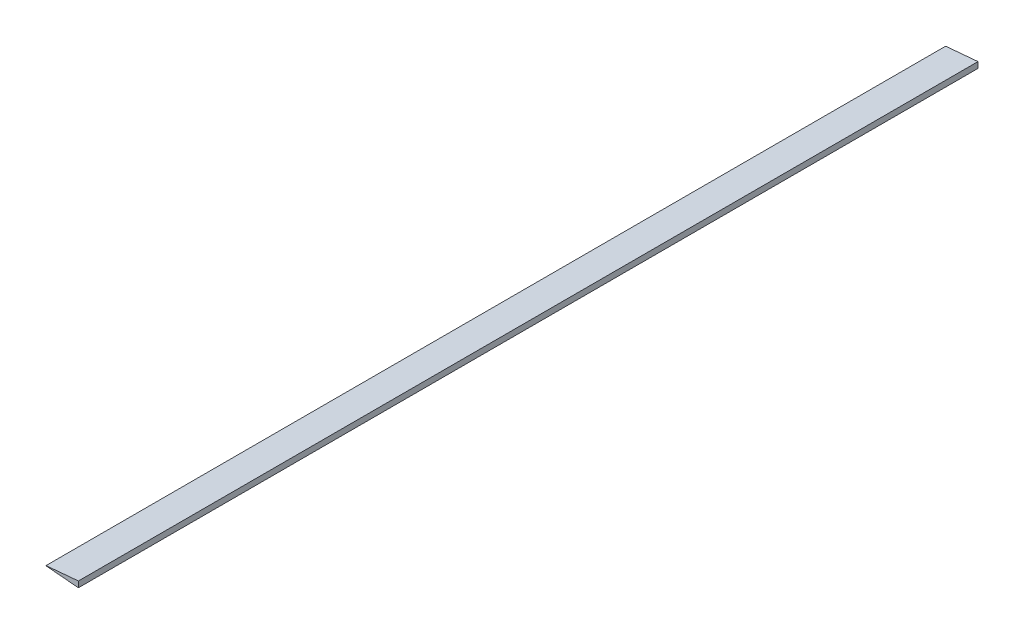
ISO-10303-21;
HEADER;
FILE_DESCRIPTION(('STEP AP214'),'2;1');
FILE_NAME('part.step','',(''),(''),'','','');
FILE_SCHEMA(('AUTOMOTIVE_DESIGN { 1 0 10303 214 1 1 1 1 }'));
ENDSEC;
DATA;
#1=APPLICATION_CONTEXT('core data for automotive mechanical design processes');
#2=APPLICATION_PROTOCOL_DEFINITION('international standard','automotive_design',2000,#1);
#3=PRODUCT_CONTEXT('',#1,'mechanical');
#4=PRODUCT('Part','Part','',(#3));
#5=PRODUCT_RELATED_PRODUCT_CATEGORY('part','',(#4));
#6=PRODUCT_DEFINITION_FORMATION('','',#4);
#7=PRODUCT_DEFINITION_CONTEXT('part definition',#1,'design');
#8=PRODUCT_DEFINITION('design','',#6,#7);
#9=PRODUCT_DEFINITION_SHAPE('','',#8);
#10=(LENGTH_UNIT() NAMED_UNIT(*) SI_UNIT(.MILLI.,.METRE.));
#11=(NAMED_UNIT(*) PLANE_ANGLE_UNIT() SI_UNIT($,.RADIAN.));
#12=(NAMED_UNIT(*) SI_UNIT($,.STERADIAN.) SOLID_ANGLE_UNIT());
#13=UNCERTAINTY_MEASURE_WITH_UNIT(LENGTH_MEASURE(1.E-05),#10,'distance_accuracy_value','');
#14=(GEOMETRIC_REPRESENTATION_CONTEXT(3) GLOBAL_UNCERTAINTY_ASSIGNED_CONTEXT((#13)) GLOBAL_UNIT_ASSIGNED_CONTEXT((#10,
#11,#12)) REPRESENTATION_CONTEXT('',''));
#15=CARTESIAN_POINT('',(0.,0.,0.));
#16=DIRECTION('',(0.,0.,1.));
#17=DIRECTION('',(1.,0.,0.));
#18=AXIS2_PLACEMENT_3D('',#15,#16,#17);
#19=CARTESIAN_POINT('',(-71.0668,2.78897868056826,422.9));
#20=CARTESIAN_POINT('',(-71.1807897571312,2.78093550481533,422.9));
#21=CARTESIAN_POINT('',(-72.8734497352901,2.66150054822879,422.9));
#22=CARTESIAN_POINT('',(-76.0510054904732,2.41542144462371,422.9));
#23=CARTESIAN_POINT('',(-80.4909559360826,2.06094965648102,422.9));
#24=CARTESIAN_POINT('',(-84.6050202734697,1.71289433734421,422.9));
#25=CARTESIAN_POINT('',(-88.3483327276746,1.38202871151509,422.9));
#26=CARTESIAN_POINT('',(-91.6798265467708,1.07524364668175,422.9));
#27=CARTESIAN_POINT('',(-94.5630134148428,0.80009068587035,422.9));
#28=CARTESIAN_POINT('',(-96.9663063511276,0.563544810077896,422.9));
#29=CARTESIAN_POINT('',(-98.8633848097534,0.372017597584994,422.9));
#30=CARTESIAN_POINT('',(-100.233471889195,0.230936429918391,422.9));
#31=CARTESIAN_POINT('',(-101.061573115194,0.144551224403757,422.9));
#32=CARTESIAN_POINT('',(-101.43130746455,0.105684165708269,422.9));
#33=CARTESIAN_POINT('',(-101.524,0.0959401799999983,422.9));
#34=B_SPLINE_CURVE_WITH_KNOTS('',3,(#19,#20,#21,#22,#23,#24,#25,#26,#27,#28,#29,#30,#31,#32,
#33),.UNSPECIFIED.,.F.,.F.,(4,1,1,1,1,1,1,1,1,1,1,1,4),(0.,0.0112115722778321,0.166483201337751,
0.312686160175411,0.448210552609216,0.571562715657405,0.681381362004341,0.776452466822885,
0.855722863352052,0.918312437422216,0.963524724344559,0.990855635167137,1.),.UNSPECIFIED.);
#35=DIRECTION('',(0.,0.,-1.));
#36=VECTOR('',#35,1.);
#37=SURFACE_OF_LINEAR_EXTRUSION('',#34,#36);
#38=CARTESIAN_POINT('',(-71.0668,2.78897868056826,-422.9));
#39=CARTESIAN_POINT('',(-71.1807897571312,2.78093550481533,-422.9));
#40=CARTESIAN_POINT('',(-72.8734497352901,2.66150054822879,-422.9));
#41=CARTESIAN_POINT('',(-76.0510054904732,2.41542144462371,-422.9));
#42=CARTESIAN_POINT('',(-80.4909559360826,2.06094965648102,-422.9));
#43=CARTESIAN_POINT('',(-84.6050202734697,1.71289433734421,-422.9));
#44=CARTESIAN_POINT('',(-88.3483327276746,1.38202871151509,-422.9));
#45=CARTESIAN_POINT('',(-91.6798265467708,1.07524364668175,-422.9));
#46=CARTESIAN_POINT('',(-94.5630134148428,0.80009068587035,-422.9));
#47=CARTESIAN_POINT('',(-96.9663063511276,0.563544810077896,-422.9));
#48=CARTESIAN_POINT('',(-98.8633848097534,0.372017597584994,-422.9));
#49=CARTESIAN_POINT('',(-100.233471889195,0.230936429918391,-422.9));
#50=CARTESIAN_POINT('',(-101.061573115194,0.144551224403757,-422.9));
#51=CARTESIAN_POINT('',(-101.43130746455,0.105684165708269,-422.9));
#52=CARTESIAN_POINT('',(-101.524,0.0959401799999983,-422.9));
#53=B_SPLINE_CURVE_WITH_KNOTS('',3,(#38,#39,#40,#41,#42,#43,#44,#45,#46,#47,#48,#49,#50,#51,
#52),.UNSPECIFIED.,.F.,.F.,(4,1,1,1,1,1,1,1,1,1,1,1,4),(0.,0.0112115722778321,0.166483201337751,
0.312686160175411,0.448210552609216,0.571562715657405,0.681381362004341,0.776452466822885,
0.855722863352052,0.918312437422216,0.963524724344559,0.990855635167137,1.),.UNSPECIFIED.);
#54=CARTESIAN_POINT('',(-71.0668,2.78897868056826,-422.9));
#55=VERTEX_POINT('',#54);
#56=CARTESIAN_POINT('',(-101.524,0.0959401799999983,-422.9));
#57=VERTEX_POINT('',#56);
#58=EDGE_CURVE('E122',#55,#57,#53,.T.);
#59=ORIENTED_EDGE('',*,*,#58,.T.);
#60=DIRECTION('',(0.,0.,-1.));
#61=VECTOR('',#60,1.);
#62=CARTESIAN_POINT('',(-101.524,0.0959401799999983,422.9));
#63=LINE('',#62,#61);
#64=CARTESIAN_POINT('',(-101.524,0.0959401799999983,422.9));
#65=VERTEX_POINT('',#64);
#66=EDGE_CURVE('E11',#65,#57,#63,.T.);
#67=ORIENTED_EDGE('',*,*,#66,.F.);
#68=CARTESIAN_POINT('',(-71.0668,2.78897868056826,422.9));
#69=VERTEX_POINT('',#68);
#70=EDGE_CURVE('E91',#69,#65,#34,.T.);
#71=ORIENTED_EDGE('',*,*,#70,.F.);
#72=DIRECTION('',(0.,0.,-1.));
#73=VECTOR('',#72,1.);
#74=CARTESIAN_POINT('',(-71.0668,2.78897868056826,422.9));
#75=LINE('',#74,#73);
#76=EDGE_CURVE('E99',#69,#55,#75,.T.);
#77=ORIENTED_EDGE('',*,*,#76,.T.);
#78=EDGE_LOOP('',(#59,#67,#71,#77));
#79=FACE_BOUND('',#78,.T.);
#80=ADVANCED_FACE('F39',(#79),#37,.F.);
#81=CARTESIAN_POINT('',(-101.524,0.0959401799999983,422.9));
#82=DIRECTION('',(1.,0.,0.));
#83=DIRECTION('',(0.,0.,-1.));
#84=AXIS2_PLACEMENT_3D('',#81,#82,#83);
#85=PLANE('',#84);
#86=DIRECTION('',(0.,-1.,0.));
#87=VECTOR('',#86,1.);
#88=CARTESIAN_POINT('',(-101.524,0.0959401799999983,-422.9));
#89=LINE('',#88,#87);
#90=CARTESIAN_POINT('',(-101.524,-0.0959401799999983,-422.9));
#91=VERTEX_POINT('',#90);
#92=EDGE_CURVE('E95',#57,#91,#89,.T.);
#93=ORIENTED_EDGE('',*,*,#92,.T.);
#94=DIRECTION('',(0.,0.,-1.));
#95=VECTOR('',#94,1.);
#96=CARTESIAN_POINT('',(-101.524,-0.0959401799999983,422.9));
#97=LINE('',#96,#95);
#98=CARTESIAN_POINT('',(-101.524,-0.0959401799999983,422.9));
#99=VERTEX_POINT('',#98);
#100=EDGE_CURVE('E48',#99,#91,#97,.T.);
#101=ORIENTED_EDGE('',*,*,#100,.F.);
#102=DIRECTION('',(0.,-1.,0.));
#103=VECTOR('',#102,1.);
#104=CARTESIAN_POINT('',(-101.524,0.0959401799999983,422.9));
#105=LINE('',#104,#103);
#106=EDGE_CURVE('E86',#65,#99,#105,.T.);
#107=ORIENTED_EDGE('',*,*,#106,.F.);
#108=ORIENTED_EDGE('',*,*,#66,.T.);
#109=EDGE_LOOP('',(#93,#101,#107,#108));
#110=FACE_BOUND('',#109,.T.);
#111=ADVANCED_FACE('F94',(#110),#85,.F.);
#112=CARTESIAN_POINT('',(-101.524,-0.0959401799999983,422.9));
#113=CARTESIAN_POINT('',(-101.43130746455,-0.105684165708269,422.9));
#114=CARTESIAN_POINT('',(-101.061573115194,-0.144551224403757,422.9));
#115=CARTESIAN_POINT('',(-100.233471889195,-0.230936429918391,422.9));
#116=CARTESIAN_POINT('',(-98.8633848097534,-0.372017597584994,422.9));
#117=CARTESIAN_POINT('',(-96.9663063511276,-0.563544810077896,422.9));
#118=CARTESIAN_POINT('',(-94.5630134148428,-0.80009068587035,422.9));
#119=CARTESIAN_POINT('',(-91.6798265467708,-1.07524364668175,422.9));
#120=CARTESIAN_POINT('',(-88.3483327276746,-1.38202871151509,422.9));
#121=CARTESIAN_POINT('',(-84.6050202734697,-1.71289433734421,422.9));
#122=CARTESIAN_POINT('',(-80.4909559360826,-2.06094965648102,422.9));
#123=CARTESIAN_POINT('',(-76.0510054904732,-2.41542144462371,422.9));
#124=CARTESIAN_POINT('',(-72.8734497352901,-2.66150054822879,422.9));
#125=CARTESIAN_POINT('',(-71.1807897571312,-2.78093550481533,422.9));
#126=CARTESIAN_POINT('',(-71.0668,-2.78897868056826,422.9));
#127=B_SPLINE_CURVE_WITH_KNOTS('',3,(#112,#113,#114,#115,#116,#117,#118,#119,#120,#121,#122,
#123,#124,#125,#126),.UNSPECIFIED.,.F.,.F.,(4,1,1,1,1,1,1,1,1,1,1,1,4),(0.,0.00914436483286329,
0.0364752756554414,0.0816875625777841,0.144277136647948,0.223547533177115,0.318618637995659,
0.428437284342595,0.551789447390784,0.687313839824589,0.833516798662249,0.988788427722168,1.),.UNSPECIFIED.);
#128=DIRECTION('',(0.,0.,-1.));
#129=VECTOR('',#128,1.);
#130=SURFACE_OF_LINEAR_EXTRUSION('',#127,#129);
#131=CARTESIAN_POINT('',(-101.524,-0.0959401799999983,-422.9));
#132=CARTESIAN_POINT('',(-101.43130746455,-0.105684165708269,-422.9));
#133=CARTESIAN_POINT('',(-101.061573115194,-0.144551224403757,-422.9));
#134=CARTESIAN_POINT('',(-100.233471889195,-0.230936429918391,-422.9));
#135=CARTESIAN_POINT('',(-98.8633848097534,-0.372017597584994,-422.9));
#136=CARTESIAN_POINT('',(-96.9663063511276,-0.563544810077896,-422.9));
#137=CARTESIAN_POINT('',(-94.5630134148428,-0.80009068587035,-422.9));
#138=CARTESIAN_POINT('',(-91.6798265467708,-1.07524364668175,-422.9));
#139=CARTESIAN_POINT('',(-88.3483327276746,-1.38202871151509,-422.9));
#140=CARTESIAN_POINT('',(-84.6050202734697,-1.71289433734421,-422.9));
#141=CARTESIAN_POINT('',(-80.4909559360826,-2.06094965648102,-422.9));
#142=CARTESIAN_POINT('',(-76.0510054904732,-2.41542144462371,-422.9));
#143=CARTESIAN_POINT('',(-72.8734497352901,-2.66150054822879,-422.9));
#144=CARTESIAN_POINT('',(-71.1807897571312,-2.78093550481533,-422.9));
#145=CARTESIAN_POINT('',(-71.0668,-2.78897868056826,-422.9));
#146=B_SPLINE_CURVE_WITH_KNOTS('',3,(#131,#132,#133,#134,#135,#136,#137,#138,#139,#140,#141,
#142,#143,#144,#145),.UNSPECIFIED.,.F.,.F.,(4,1,1,1,1,1,1,1,1,1,1,1,4),(0.,0.00914436483286329,
0.0364752756554414,0.0816875625777841,0.144277136647948,0.223547533177115,0.318618637995659,
0.428437284342595,0.551789447390784,0.687313839824589,0.833516798662249,0.988788427722168,1.),.UNSPECIFIED.);
#147=CARTESIAN_POINT('',(-71.0668,-2.78897868056826,-422.9));
#148=VERTEX_POINT('',#147);
#149=EDGE_CURVE('E73',#91,#148,#146,.T.);
#150=ORIENTED_EDGE('',*,*,#149,.T.);
#151=DIRECTION('',(0.,0.,-1.));
#152=VECTOR('',#151,1.);
#153=CARTESIAN_POINT('',(-71.0668,-2.78897868056826,422.9));
#154=LINE('',#153,#152);
#155=CARTESIAN_POINT('',(-71.0668,-2.78897868056826,422.9));
#156=VERTEX_POINT('',#155);
#157=EDGE_CURVE('E96',#156,#148,#154,.T.);
#158=ORIENTED_EDGE('',*,*,#157,.F.);
#159=EDGE_CURVE('E89',#99,#156,#127,.T.);
#160=ORIENTED_EDGE('',*,*,#159,.F.);
#161=ORIENTED_EDGE('',*,*,#100,.T.);
#162=EDGE_LOOP('',(#150,#158,#160,#161));
#163=FACE_BOUND('',#162,.T.);
#164=ADVANCED_FACE('F97',(#163),#130,.F.);
#165=CARTESIAN_POINT('',(-71.0668,2.78897868056826,422.9));
#166=DIRECTION('',(-1.,0.,0.));
#167=DIRECTION('',(0.,0.,1.));
#168=AXIS2_PLACEMENT_3D('',#165,#166,#167);
#169=PLANE('',#168);
#170=DIRECTION('',(0.,1.,0.));
#171=VECTOR('',#170,1.);
#172=CARTESIAN_POINT('',(-71.0668,2.78897868056826,-422.9));
#173=LINE('',#172,#171);
#174=EDGE_CURVE('E79',#148,#55,#173,.T.);
#175=ORIENTED_EDGE('',*,*,#174,.T.);
#176=ORIENTED_EDGE('',*,*,#76,.F.);
#177=DIRECTION('',(0.,1.,0.));
#178=VECTOR('',#177,1.);
#179=CARTESIAN_POINT('',(-71.0668,2.78897868056826,422.9));
#180=LINE('',#179,#178);
#181=EDGE_CURVE('E56',#156,#69,#180,.T.);
#182=ORIENTED_EDGE('',*,*,#181,.F.);
#183=ORIENTED_EDGE('',*,*,#157,.T.);
#184=EDGE_LOOP('',(#175,#176,#182,#183));
#185=FACE_BOUND('',#184,.T.);
#186=ADVANCED_FACE('F111',(#185),#169,.F.);
#187=CARTESIAN_POINT('',(-86.3059826350048,1.56192620308215,422.9));
#188=DIRECTION('',(0.,0.,-1.));
#189=DIRECTION('',(-1.,0.,0.));
#190=AXIS2_PLACEMENT_3D('',#187,#188,#189);
#191=PLANE('',#190);
#192=ORIENTED_EDGE('',*,*,#70,.T.);
#193=ORIENTED_EDGE('',*,*,#106,.T.);
#194=ORIENTED_EDGE('',*,*,#159,.T.);
#195=ORIENTED_EDGE('',*,*,#181,.T.);
#196=EDGE_LOOP('',(#192,#193,#194,#195));
#197=FACE_BOUND('',#196,.T.);
#198=ADVANCED_FACE('F87',(#197),#191,.F.);
#199=CARTESIAN_POINT('',(-86.3059826350048,1.56192620308215,-422.9));
#200=DIRECTION('',(0.,0.,-1.));
#201=DIRECTION('',(-1.,0.,0.));
#202=AXIS2_PLACEMENT_3D('',#199,#200,#201);
#203=PLANE('',#202);
#204=ORIENTED_EDGE('',*,*,#58,.F.);
#205=ORIENTED_EDGE('',*,*,#174,.F.);
#206=ORIENTED_EDGE('',*,*,#149,.F.);
#207=ORIENTED_EDGE('',*,*,#92,.F.);
#208=EDGE_LOOP('',(#204,#205,#206,#207));
#209=FACE_BOUND('',#208,.T.);
#210=ADVANCED_FACE('F139',(#209),#203,.T.);
#211=CLOSED_SHELL('',(#80,#111,#164,#186,#198,#210));
#212=MANIFOLD_SOLID_BREP('B2',#211);
#213=ADVANCED_BREP_SHAPE_REPRESENTATION('',(#18,#212),#14);
#214=SHAPE_DEFINITION_REPRESENTATION(#9,#213);
ENDSEC;
END-ISO-10303-21;
